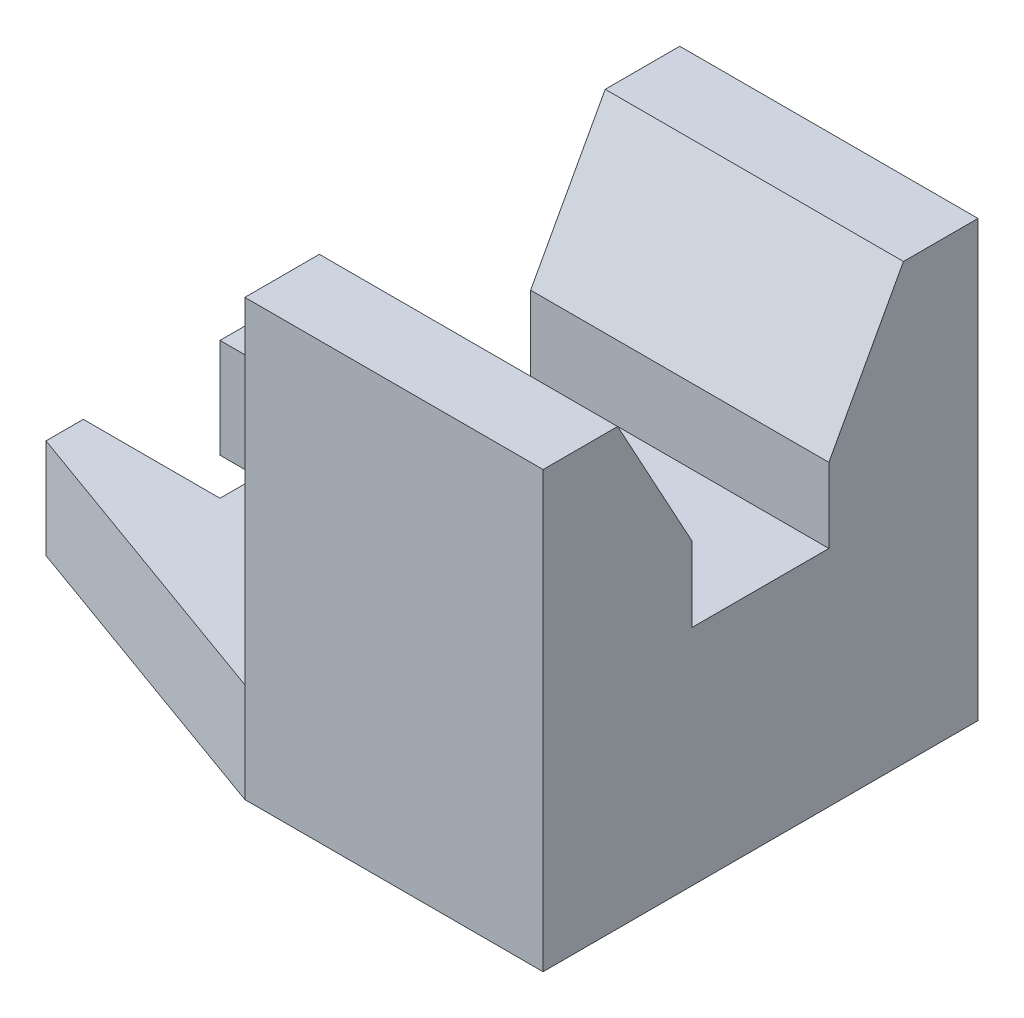
ISO-10303-21;
HEADER;
FILE_DESCRIPTION(('STEP AP214'),'2;1');
FILE_NAME('part.step','',(''),(''),'','','');
FILE_SCHEMA(('AUTOMOTIVE_DESIGN { 1 0 10303 214 1 1 1 1 }'));
ENDSEC;
DATA;
#1=APPLICATION_CONTEXT('core data for automotive mechanical design processes');
#2=APPLICATION_PROTOCOL_DEFINITION('international standard','automotive_design',2000,#1);
#3=PRODUCT_CONTEXT('',#1,'mechanical');
#4=PRODUCT('Part','Part','',(#3));
#5=PRODUCT_RELATED_PRODUCT_CATEGORY('part','',(#4));
#6=PRODUCT_DEFINITION_FORMATION('','',#4);
#7=PRODUCT_DEFINITION_CONTEXT('part definition',#1,'design');
#8=PRODUCT_DEFINITION('design','',#6,#7);
#9=PRODUCT_DEFINITION_SHAPE('','',#8);
#10=(LENGTH_UNIT() NAMED_UNIT(*) SI_UNIT(.MILLI.,.METRE.));
#11=(NAMED_UNIT(*) PLANE_ANGLE_UNIT() SI_UNIT($,.RADIAN.));
#12=(NAMED_UNIT(*) SI_UNIT($,.STERADIAN.) SOLID_ANGLE_UNIT());
#13=UNCERTAINTY_MEASURE_WITH_UNIT(LENGTH_MEASURE(1.E-05),#10,'distance_accuracy_value','');
#14=(GEOMETRIC_REPRESENTATION_CONTEXT(3) GLOBAL_UNCERTAINTY_ASSIGNED_CONTEXT((#13)) GLOBAL_UNIT_ASSIGNED_CONTEXT((#10,
#11,#12)) REPRESENTATION_CONTEXT('',''));
#15=CARTESIAN_POINT('',(0.,0.,0.));
#16=DIRECTION('',(0.,0.,1.));
#17=DIRECTION('',(1.,0.,0.));
#18=AXIS2_PLACEMENT_3D('',#15,#16,#17);
#19=CARTESIAN_POINT('',(0.,35.,0.));
#20=DIRECTION('',(0.,-1.,0.));
#21=DIRECTION('',(0.,0.,-1.));
#22=AXIS2_PLACEMENT_3D('',#19,#20,#21);
#23=PLANE('',#22);
#24=DIRECTION('',(0.,0.,-1.));
#25=VECTOR('',#24,1.);
#26=CARTESIAN_POINT('',(12.,35.,-17.5));
#27=LINE('',#26,#25);
#28=CARTESIAN_POINT('',(12.,35.,17.5));
#29=VERTEX_POINT('',#28);
#30=CARTESIAN_POINT('',(12.,35.,11.5));
#31=VERTEX_POINT('',#30);
#32=EDGE_CURVE('E247',#29,#31,#27,.T.);
#33=ORIENTED_EDGE('',*,*,#32,.T.);
#34=DIRECTION('',(-1.,0.,0.));
#35=VECTOR('',#34,1.);
#36=CARTESIAN_POINT('',(0.,35.,11.5));
#37=LINE('',#36,#35);
#38=CARTESIAN_POINT('',(-12.,35.,11.5));
#39=VERTEX_POINT('',#38);
#40=EDGE_CURVE('E11',#31,#39,#37,.T.);
#41=ORIENTED_EDGE('',*,*,#40,.T.);
#42=DIRECTION('',(0.,0.,1.));
#43=VECTOR('',#42,1.);
#44=CARTESIAN_POINT('',(-12.,35.,-17.5));
#45=LINE('',#44,#43);
#46=CARTESIAN_POINT('',(-12.,35.,17.5));
#47=VERTEX_POINT('',#46);
#48=EDGE_CURVE('E260',#39,#47,#45,.T.);
#49=ORIENTED_EDGE('',*,*,#48,.T.);
#50=DIRECTION('',(1.,0.,0.));
#51=VECTOR('',#50,1.);
#52=CARTESIAN_POINT('',(12.,35.,17.5));
#53=LINE('',#52,#51);
#54=EDGE_CURVE('E263',#47,#29,#53,.T.);
#55=ORIENTED_EDGE('',*,*,#54,.T.);
#56=EDGE_LOOP('',(#33,#41,#49,#55));
#57=FACE_BOUND('',#56,.T.);
#58=ADVANCED_FACE('F45',(#57),#23,.F.);
#59=CARTESIAN_POINT('',(0.,8.,0.));
#60=DIRECTION('',(0.,-1.,0.));
#61=DIRECTION('',(0.,0.,-1.));
#62=AXIS2_PLACEMENT_3D('',#59,#60,#61);
#63=PLANE('',#62);
#64=DIRECTION('',(0.,0.,1.));
#65=VECTOR('',#64,1.);
#66=CARTESIAN_POINT('',(-12.,8.,-17.5));
#67=LINE('',#66,#65);
#68=CARTESIAN_POINT('',(-12.,8.,-17.5));
#69=VERTEX_POINT('',#68);
#70=CARTESIAN_POINT('',(-12.,8.,17.5));
#71=VERTEX_POINT('',#70);
#72=EDGE_CURVE('E117',#69,#71,#67,.T.);
#73=ORIENTED_EDGE('',*,*,#72,.F.);
#74=DIRECTION('',(-0.940887411868726,0.,0.338719468272743));
#75=VECTOR('',#74,1.);
#76=CARTESIAN_POINT('',(-12.,8.,-17.5));
#77=LINE('',#76,#75);
#78=CARTESIAN_POINT('',(-36.9999999999999,8.,-8.5));
#79=VERTEX_POINT('',#78);
#80=EDGE_CURVE('E197',#69,#79,#77,.T.);
#81=ORIENTED_EDGE('',*,*,#80,.T.);
#82=DIRECTION('',(0.,0.,1.));
#83=VECTOR('',#82,1.);
#84=CARTESIAN_POINT('',(-36.9999999999999,8.,-8.5));
#85=LINE('',#84,#83);
#86=CARTESIAN_POINT('',(-37.,8.,-5.5));
#87=VERTEX_POINT('',#86);
#88=EDGE_CURVE('E276',#79,#87,#85,.T.);
#89=ORIENTED_EDGE('',*,*,#88,.T.);
#90=DIRECTION('',(1.,0.,0.));
#91=VECTOR('',#90,1.);
#92=CARTESIAN_POINT('',(-37.,8.,-5.5));
#93=LINE('',#92,#91);
#94=CARTESIAN_POINT('',(-26.,8.,-5.5));
#95=VERTEX_POINT('',#94);
#96=EDGE_CURVE('E138',#87,#95,#93,.T.);
#97=ORIENTED_EDGE('',*,*,#96,.T.);
#98=DIRECTION('',(0.,0.,1.));
#99=VECTOR('',#98,1.);
#100=CARTESIAN_POINT('',(-26.,8.,-5.5));
#101=LINE('',#100,#99);
#102=CARTESIAN_POINT('',(-26.,8.,5.5));
#103=VERTEX_POINT('',#102);
#104=EDGE_CURVE('E131',#95,#103,#101,.T.);
#105=ORIENTED_EDGE('',*,*,#104,.T.);
#106=DIRECTION('',(-1.,0.,0.));
#107=VECTOR('',#106,1.);
#108=CARTESIAN_POINT('',(-37.,8.,5.5));
#109=LINE('',#108,#107);
#110=CARTESIAN_POINT('',(-37.,8.,5.5));
#111=VERTEX_POINT('',#110);
#112=EDGE_CURVE('E135',#103,#111,#109,.T.);
#113=ORIENTED_EDGE('',*,*,#112,.T.);
#114=DIRECTION('',(0.,0.,1.));
#115=VECTOR('',#114,1.);
#116=CARTESIAN_POINT('',(-36.9999999999999,8.,8.5));
#117=LINE('',#116,#115);
#118=CARTESIAN_POINT('',(-36.9999999999999,8.,8.5));
#119=VERTEX_POINT('',#118);
#120=EDGE_CURVE('E70',#111,#119,#117,.T.);
#121=ORIENTED_EDGE('',*,*,#120,.T.);
#122=DIRECTION('',(0.940887411868726,0.,0.338719468272743));
#123=VECTOR('',#122,1.);
#124=CARTESIAN_POINT('',(-12.,8.,17.5));
#125=LINE('',#124,#123);
#126=EDGE_CURVE('E160',#119,#71,#125,.T.);
#127=ORIENTED_EDGE('',*,*,#126,.T.);
#128=EDGE_LOOP('',(#73,#81,#89,#97,#105,#113,#121,#127));
#129=FACE_BOUND('',#128,.T.);
#130=ADVANCED_FACE('F133',(#129),#63,.F.);
#131=CARTESIAN_POINT('',(12.,8.,17.5));
#132=DIRECTION('',(-1.,0.,0.));
#133=DIRECTION('',(0.,0.,1.));
#134=AXIS2_PLACEMENT_3D('',#131,#132,#133);
#135=PLANE('',#134);
#136=DIRECTION('',(0.,1.,0.));
#137=VECTOR('',#136,1.);
#138=CARTESIAN_POINT('',(12.,8.,5.5));
#139=LINE('',#138,#137);
#140=CARTESIAN_POINT('',(12.,18.,5.5));
#141=VERTEX_POINT('',#140);
#142=CARTESIAN_POINT('',(12.,24.,5.5));
#143=VERTEX_POINT('',#142);
#144=EDGE_CURVE('E253',#141,#143,#139,.T.);
#145=ORIENTED_EDGE('',*,*,#144,.T.);
#146=DIRECTION('',(0.,0.877895572914385,0.478852130680572));
#147=VECTOR('',#146,1.);
#148=CARTESIAN_POINT('',(12.,16.7133757961783,1.52547770700637));
#149=LINE('',#148,#147);
#150=EDGE_CURVE('E376',#143,#31,#149,.T.);
#151=ORIENTED_EDGE('',*,*,#150,.T.);
#152=ORIENTED_EDGE('',*,*,#32,.F.);
#153=DIRECTION('',(0.,-1.,0.));
#154=VECTOR('',#153,1.);
#155=CARTESIAN_POINT('',(12.,8.,17.5));
#156=LINE('',#155,#154);
#157=CARTESIAN_POINT('',(12.,0.,17.5));
#158=VERTEX_POINT('',#157);
#159=EDGE_CURVE('E166',#29,#158,#156,.T.);
#160=ORIENTED_EDGE('',*,*,#159,.T.);
#161=DIRECTION('',(0.,0.,-1.));
#162=VECTOR('',#161,1.);
#163=CARTESIAN_POINT('',(12.,0.,17.5));
#164=LINE('',#163,#162);
#165=CARTESIAN_POINT('',(12.,0.,-17.5));
#166=VERTEX_POINT('',#165);
#167=EDGE_CURVE('E167',#158,#166,#164,.T.);
#168=ORIENTED_EDGE('',*,*,#167,.T.);
#169=DIRECTION('',(0.,-1.,0.));
#170=VECTOR('',#169,1.);
#171=CARTESIAN_POINT('',(12.,8.,-17.5));
#172=LINE('',#171,#170);
#173=CARTESIAN_POINT('',(12.,35.,-17.5));
#174=VERTEX_POINT('',#173);
#175=EDGE_CURVE('E223',#174,#166,#172,.T.);
#176=ORIENTED_EDGE('',*,*,#175,.F.);
#177=CARTESIAN_POINT('',(12.,35.,-11.5));
#178=VERTEX_POINT('',#177);
#179=EDGE_CURVE('E234',#178,#174,#27,.T.);
#180=ORIENTED_EDGE('',*,*,#179,.F.);
#181=DIRECTION('',(0.,-0.877895572914385,0.478852130680572));
#182=VECTOR('',#181,1.);
#183=CARTESIAN_POINT('',(12.,2.,6.49999999999997));
#184=LINE('',#183,#182);
#185=CARTESIAN_POINT('',(12.,24.,-5.5));
#186=VERTEX_POINT('',#185);
#187=EDGE_CURVE('E61',#178,#186,#184,.T.);
#188=ORIENTED_EDGE('',*,*,#187,.T.);
#189=DIRECTION('',(0.,-1.,0.));
#190=VECTOR('',#189,1.);
#191=CARTESIAN_POINT('',(12.,7.99999999999999,-5.5));
#192=LINE('',#191,#190);
#193=CARTESIAN_POINT('',(12.,18.,-5.5));
#194=VERTEX_POINT('',#193);
#195=EDGE_CURVE('E343',#186,#194,#192,.T.);
#196=ORIENTED_EDGE('',*,*,#195,.T.);
#197=DIRECTION('',(0.,0.,1.));
#198=VECTOR('',#197,1.);
#199=CARTESIAN_POINT('',(12.,18.,17.5));
#200=LINE('',#199,#198);
#201=EDGE_CURVE('E380',#194,#141,#200,.T.);
#202=ORIENTED_EDGE('',*,*,#201,.T.);
#203=EDGE_LOOP('',(#145,#151,#152,#160,#168,#176,#180,#188,#196,#202));
#204=FACE_BOUND('',#203,.T.);
#205=ADVANCED_FACE('F47',(#204),#135,.F.);
#206=CARTESIAN_POINT('',(-12.,8.,-17.5));
#207=DIRECTION('',(0.,0.,1.));
#208=DIRECTION('',(1.,0.,0.));
#209=AXIS2_PLACEMENT_3D('',#206,#207,#208);
#210=PLANE('',#209);
#211=DIRECTION('',(-1.,0.,0.));
#212=VECTOR('',#211,1.);
#213=CARTESIAN_POINT('',(-12.,0.,-17.5));
#214=LINE('',#213,#212);
#215=CARTESIAN_POINT('',(-12.,0.,-17.5));
#216=VERTEX_POINT('',#215);
#217=EDGE_CURVE('E171',#166,#216,#214,.T.);
#218=ORIENTED_EDGE('',*,*,#217,.T.);
#219=DIRECTION('',(0.,-1.,0.));
#220=VECTOR('',#219,1.);
#221=CARTESIAN_POINT('',(-12.,8.,-17.5));
#222=LINE('',#221,#220);
#223=EDGE_CURVE('E219',#69,#216,#222,.T.);
#224=ORIENTED_EDGE('',*,*,#223,.F.);
#225=DIRECTION('',(0.,-1.,0.));
#226=VECTOR('',#225,1.);
#227=CARTESIAN_POINT('',(-12.,35.,-17.5));
#228=LINE('',#227,#226);
#229=CARTESIAN_POINT('',(-12.,35.,-17.5));
#230=VERTEX_POINT('',#229);
#231=EDGE_CURVE('E172',#230,#69,#228,.T.);
#232=ORIENTED_EDGE('',*,*,#231,.F.);
#233=DIRECTION('',(-1.,0.,0.));
#234=VECTOR('',#233,1.);
#235=CARTESIAN_POINT('',(12.,35.,-17.5));
#236=LINE('',#235,#234);
#237=EDGE_CURVE('E252',#174,#230,#236,.T.);
#238=ORIENTED_EDGE('',*,*,#237,.F.);
#239=ORIENTED_EDGE('',*,*,#175,.T.);
#240=EDGE_LOOP('',(#218,#224,#232,#238,#239));
#241=FACE_BOUND('',#240,.T.);
#242=ADVANCED_FACE('F303',(#241),#210,.F.);
#243=CARTESIAN_POINT('',(-12.,8.,-17.5));
#244=DIRECTION('',(0.338719468272743,0.,0.940887411868726));
#245=DIRECTION('',(0.940887411868727,0.,-0.338719468272743));
#246=AXIS2_PLACEMENT_3D('',#243,#244,#245);
#247=PLANE('',#246);
#248=DIRECTION('',(-0.940887411868726,0.,0.338719468272743));
#249=VECTOR('',#248,1.);
#250=CARTESIAN_POINT('',(-12.,0.,-17.5));
#251=LINE('',#250,#249);
#252=CARTESIAN_POINT('',(-36.9999999999999,0.,-8.5));
#253=VERTEX_POINT('',#252);
#254=EDGE_CURVE('E175',#216,#253,#251,.T.);
#255=ORIENTED_EDGE('',*,*,#254,.T.);
#256=DIRECTION('',(0.,-1.,0.));
#257=VECTOR('',#256,1.);
#258=CARTESIAN_POINT('',(-36.9999999999999,8.,-8.5));
#259=LINE('',#258,#257);
#260=EDGE_CURVE('E215',#79,#253,#259,.T.);
#261=ORIENTED_EDGE('',*,*,#260,.F.);
#262=ORIENTED_EDGE('',*,*,#80,.F.);
#263=ORIENTED_EDGE('',*,*,#223,.T.);
#264=EDGE_LOOP('',(#255,#261,#262,#263));
#265=FACE_BOUND('',#264,.T.);
#266=ADVANCED_FACE('F440',(#265),#247,.F.);
#267=CARTESIAN_POINT('',(-36.9999999999999,8.,-8.5));
#268=DIRECTION('',(1.,0.,0.));
#269=DIRECTION('',(0.,0.,-1.));
#270=AXIS2_PLACEMENT_3D('',#267,#268,#269);
#271=PLANE('',#270);
#272=DIRECTION('',(0.,0.,1.));
#273=VECTOR('',#272,1.);
#274=CARTESIAN_POINT('',(-36.9999999999999,0.,-8.5));
#275=LINE('',#274,#273);
#276=CARTESIAN_POINT('',(-37.,0.,-5.5));
#277=VERTEX_POINT('',#276);
#278=EDGE_CURVE('E178',#253,#277,#275,.T.);
#279=ORIENTED_EDGE('',*,*,#278,.T.);
#280=DIRECTION('',(0.,-1.,0.));
#281=VECTOR('',#280,1.);
#282=CARTESIAN_POINT('',(-37.,8.,-5.5));
#283=LINE('',#282,#281);
#284=EDGE_CURVE('E211',#87,#277,#283,.T.);
#285=ORIENTED_EDGE('',*,*,#284,.F.);
#286=ORIENTED_EDGE('',*,*,#88,.F.);
#287=ORIENTED_EDGE('',*,*,#260,.T.);
#288=EDGE_LOOP('',(#279,#285,#286,#287));
#289=FACE_BOUND('',#288,.T.);
#290=ADVANCED_FACE('F436',(#289),#271,.F.);
#291=CARTESIAN_POINT('',(-37.,8.,-5.5));
#292=DIRECTION('',(0.,0.,-1.));
#293=DIRECTION('',(-1.,0.,0.));
#294=AXIS2_PLACEMENT_3D('',#291,#292,#293);
#295=PLANE('',#294);
#296=DIRECTION('',(1.,0.,0.));
#297=VECTOR('',#296,1.);
#298=CARTESIAN_POINT('',(-37.,0.,-5.5));
#299=LINE('',#298,#297);
#300=CARTESIAN_POINT('',(-26.,0.,-5.5));
#301=VERTEX_POINT('',#300);
#302=EDGE_CURVE('E181',#277,#301,#299,.T.);
#303=ORIENTED_EDGE('',*,*,#302,.T.);
#304=DIRECTION('',(0.,-1.,0.));
#305=VECTOR('',#304,1.);
#306=CARTESIAN_POINT('',(-26.,8.,-5.5));
#307=LINE('',#306,#305);
#308=EDGE_CURVE('E152',#95,#301,#307,.T.);
#309=ORIENTED_EDGE('',*,*,#308,.F.);
#310=ORIENTED_EDGE('',*,*,#96,.F.);
#311=ORIENTED_EDGE('',*,*,#284,.T.);
#312=EDGE_LOOP('',(#303,#309,#310,#311));
#313=FACE_BOUND('',#312,.T.);
#314=ADVANCED_FACE('F433',(#313),#295,.F.);
#315=CARTESIAN_POINT('',(-26.,8.,-5.5));
#316=DIRECTION('',(1.,0.,0.));
#317=DIRECTION('',(0.,0.,-1.));
#318=AXIS2_PLACEMENT_3D('',#315,#316,#317);
#319=PLANE('',#318);
#320=DIRECTION('',(0.,0.,1.));
#321=VECTOR('',#320,1.);
#322=CARTESIAN_POINT('',(-26.,0.,-5.5));
#323=LINE('',#322,#321);
#324=CARTESIAN_POINT('',(-26.,0.,5.5));
#325=VERTEX_POINT('',#324);
#326=EDGE_CURVE('E148',#301,#325,#323,.T.);
#327=ORIENTED_EDGE('',*,*,#326,.T.);
#328=DIRECTION('',(0.,-1.,0.));
#329=VECTOR('',#328,1.);
#330=CARTESIAN_POINT('',(-26.,8.,5.5));
#331=LINE('',#330,#329);
#332=EDGE_CURVE('E145',#103,#325,#331,.T.);
#333=ORIENTED_EDGE('',*,*,#332,.F.);
#334=ORIENTED_EDGE('',*,*,#104,.F.);
#335=ORIENTED_EDGE('',*,*,#308,.T.);
#336=EDGE_LOOP('',(#327,#333,#334,#335));
#337=FACE_BOUND('',#336,.T.);
#338=ADVANCED_FACE('F146',(#337),#319,.F.);
#339=CARTESIAN_POINT('',(-37.,8.,5.5));
#340=DIRECTION('',(0.,0.,1.));
#341=DIRECTION('',(1.,0.,0.));
#342=AXIS2_PLACEMENT_3D('',#339,#340,#341);
#343=PLANE('',#342);
#344=DIRECTION('',(-1.,0.,0.));
#345=VECTOR('',#344,1.);
#346=CARTESIAN_POINT('',(-37.,0.,5.5));
#347=LINE('',#346,#345);
#348=CARTESIAN_POINT('',(-37.,0.,5.5));
#349=VERTEX_POINT('',#348);
#350=EDGE_CURVE('E186',#325,#349,#347,.T.);
#351=ORIENTED_EDGE('',*,*,#350,.T.);
#352=DIRECTION('',(0.,-1.,0.));
#353=VECTOR('',#352,1.);
#354=CARTESIAN_POINT('',(-37.,8.,5.5));
#355=LINE('',#354,#353);
#356=EDGE_CURVE('E153',#111,#349,#355,.T.);
#357=ORIENTED_EDGE('',*,*,#356,.F.);
#358=ORIENTED_EDGE('',*,*,#112,.F.);
#359=ORIENTED_EDGE('',*,*,#332,.T.);
#360=EDGE_LOOP('',(#351,#357,#358,#359));
#361=FACE_BOUND('',#360,.T.);
#362=ADVANCED_FACE('F155',(#361),#343,.F.);
#363=CARTESIAN_POINT('',(-36.9999999999999,8.,8.5));
#364=DIRECTION('',(1.,0.,0.));
#365=DIRECTION('',(0.,0.,-1.));
#366=AXIS2_PLACEMENT_3D('',#363,#364,#365);
#367=PLANE('',#366);
#368=DIRECTION('',(0.,0.,1.));
#369=VECTOR('',#368,1.);
#370=CARTESIAN_POINT('',(-36.9999999999999,0.,8.5));
#371=LINE('',#370,#369);
#372=CARTESIAN_POINT('',(-36.9999999999999,0.,8.5));
#373=VERTEX_POINT('',#372);
#374=EDGE_CURVE('E189',#349,#373,#371,.T.);
#375=ORIENTED_EDGE('',*,*,#374,.T.);
#376=DIRECTION('',(0.,-1.,0.));
#377=VECTOR('',#376,1.);
#378=CARTESIAN_POINT('',(-36.9999999999999,8.,8.5));
#379=LINE('',#378,#377);
#380=EDGE_CURVE('E203',#119,#373,#379,.T.);
#381=ORIENTED_EDGE('',*,*,#380,.F.);
#382=ORIENTED_EDGE('',*,*,#120,.F.);
#383=ORIENTED_EDGE('',*,*,#356,.T.);
#384=EDGE_LOOP('',(#375,#381,#382,#383));
#385=FACE_BOUND('',#384,.T.);
#386=ADVANCED_FACE('F424',(#385),#367,.F.);
#387=CARTESIAN_POINT('',(-12.,8.,17.5));
#388=DIRECTION('',(0.338719468272743,0.,-0.940887411868726));
#389=DIRECTION('',(-0.940887411868727,0.,-0.338719468272743));
#390=AXIS2_PLACEMENT_3D('',#387,#388,#389);
#391=PLANE('',#390);
#392=DIRECTION('',(0.940887411868726,0.,0.338719468272743));
#393=VECTOR('',#392,1.);
#394=CARTESIAN_POINT('',(-12.,0.,17.5));
#395=LINE('',#394,#393);
#396=CARTESIAN_POINT('',(-12.,0.,17.5));
#397=VERTEX_POINT('',#396);
#398=EDGE_CURVE('E192',#373,#397,#395,.T.);
#399=ORIENTED_EDGE('',*,*,#398,.T.);
#400=DIRECTION('',(0.,-1.,0.));
#401=VECTOR('',#400,1.);
#402=CARTESIAN_POINT('',(-12.,8.,17.5));
#403=LINE('',#402,#401);
#404=EDGE_CURVE('E200',#71,#397,#403,.T.);
#405=ORIENTED_EDGE('',*,*,#404,.F.);
#406=ORIENTED_EDGE('',*,*,#126,.F.);
#407=ORIENTED_EDGE('',*,*,#380,.T.);
#408=EDGE_LOOP('',(#399,#405,#406,#407));
#409=FACE_BOUND('',#408,.T.);
#410=ADVANCED_FACE('F421',(#409),#391,.F.);
#411=CARTESIAN_POINT('',(-12.,8.,17.5));
#412=DIRECTION('',(0.,0.,-1.));
#413=DIRECTION('',(-1.,0.,0.));
#414=AXIS2_PLACEMENT_3D('',#411,#412,#413);
#415=PLANE('',#414);
#416=DIRECTION('',(1.,0.,0.));
#417=VECTOR('',#416,1.);
#418=CARTESIAN_POINT('',(-12.,0.,17.5));
#419=LINE('',#418,#417);
#420=EDGE_CURVE('E110',#397,#158,#419,.T.);
#421=ORIENTED_EDGE('',*,*,#420,.T.);
#422=ORIENTED_EDGE('',*,*,#159,.F.);
#423=ORIENTED_EDGE('',*,*,#54,.F.);
#424=DIRECTION('',(0.,-1.,0.));
#425=VECTOR('',#424,1.);
#426=CARTESIAN_POINT('',(-12.,35.,17.5));
#427=LINE('',#426,#425);
#428=EDGE_CURVE('E266',#47,#71,#427,.T.);
#429=ORIENTED_EDGE('',*,*,#428,.T.);
#430=ORIENTED_EDGE('',*,*,#404,.T.);
#431=EDGE_LOOP('',(#421,#422,#423,#429,#430));
#432=FACE_BOUND('',#431,.T.);
#433=ADVANCED_FACE('F294',(#432),#415,.F.);
#434=CARTESIAN_POINT('',(0.,0.,0.));
#435=DIRECTION('',(0.,-1.,0.));
#436=DIRECTION('',(0.,0.,-1.));
#437=AXIS2_PLACEMENT_3D('',#434,#435,#436);
#438=PLANE('',#437);
#439=ORIENTED_EDGE('',*,*,#167,.F.);
#440=ORIENTED_EDGE('',*,*,#420,.F.);
#441=ORIENTED_EDGE('',*,*,#398,.F.);
#442=ORIENTED_EDGE('',*,*,#374,.F.);
#443=ORIENTED_EDGE('',*,*,#350,.F.);
#444=ORIENTED_EDGE('',*,*,#326,.F.);
#445=ORIENTED_EDGE('',*,*,#302,.F.);
#446=ORIENTED_EDGE('',*,*,#278,.F.);
#447=ORIENTED_EDGE('',*,*,#254,.F.);
#448=ORIENTED_EDGE('',*,*,#217,.F.);
#449=EDGE_LOOP('',(#439,#440,#441,#442,#443,#444,#445,#446,#447,#448));
#450=FACE_BOUND('',#449,.T.);
#451=ADVANCED_FACE('F298',(#450),#438,.T.);
#452=CARTESIAN_POINT('',(-12.,35.,-17.5));
#453=DIRECTION('',(1.,0.,0.));
#454=DIRECTION('',(0.,0.,-1.));
#455=AXIS2_PLACEMENT_3D('',#452,#453,#454);
#456=PLANE('',#455);
#457=ORIENTED_EDGE('',*,*,#48,.F.);
#458=DIRECTION('',(0.,0.877895572914385,0.478852130680572));
#459=VECTOR('',#458,1.);
#460=CARTESIAN_POINT('',(-12.,35.,11.5));
#461=LINE('',#460,#459);
#462=CARTESIAN_POINT('',(-12.,24.,5.5));
#463=VERTEX_POINT('',#462);
#464=EDGE_CURVE('E346',#463,#39,#461,.T.);
#465=ORIENTED_EDGE('',*,*,#464,.F.);
#466=DIRECTION('',(0.,1.,0.));
#467=VECTOR('',#466,1.);
#468=CARTESIAN_POINT('',(-12.,24.,5.5));
#469=LINE('',#468,#467);
#470=CARTESIAN_POINT('',(-12.,18.,5.5));
#471=VERTEX_POINT('',#470);
#472=EDGE_CURVE('E358',#471,#463,#469,.T.);
#473=ORIENTED_EDGE('',*,*,#472,.F.);
#474=DIRECTION('',(0.,0.,1.));
#475=VECTOR('',#474,1.);
#476=CARTESIAN_POINT('',(-12.,18.,-5.5));
#477=LINE('',#476,#475);
#478=CARTESIAN_POINT('',(-12.,18.,-5.5));
#479=VERTEX_POINT('',#478);
#480=EDGE_CURVE('E354',#479,#471,#477,.T.);
#481=ORIENTED_EDGE('',*,*,#480,.F.);
#482=DIRECTION('',(0.,-1.,0.));
#483=VECTOR('',#482,1.);
#484=CARTESIAN_POINT('',(-12.,24.,-5.5));
#485=LINE('',#484,#483);
#486=CARTESIAN_POINT('',(-12.,24.,-5.5));
#487=VERTEX_POINT('',#486);
#488=EDGE_CURVE('E341',#487,#479,#485,.T.);
#489=ORIENTED_EDGE('',*,*,#488,.F.);
#490=DIRECTION('',(0.,-0.877895572914385,0.478852130680572));
#491=VECTOR('',#490,1.);
#492=CARTESIAN_POINT('',(-12.,35.,-11.5));
#493=LINE('',#492,#491);
#494=CARTESIAN_POINT('',(-12.,35.,-11.5));
#495=VERTEX_POINT('',#494);
#496=EDGE_CURVE('E348',#495,#487,#493,.T.);
#497=ORIENTED_EDGE('',*,*,#496,.F.);
#498=EDGE_CURVE('E238',#230,#495,#45,.T.);
#499=ORIENTED_EDGE('',*,*,#498,.F.);
#500=ORIENTED_EDGE('',*,*,#231,.T.);
#501=ORIENTED_EDGE('',*,*,#72,.T.);
#502=ORIENTED_EDGE('',*,*,#428,.F.);
#503=EDGE_LOOP('',(#457,#465,#473,#481,#489,#497,#499,#500,#501,#502));
#504=FACE_BOUND('',#503,.T.);
#505=ADVANCED_FACE('F293',(#504),#456,.F.);
#506=ORIENTED_EDGE('',*,*,#498,.T.);
#507=DIRECTION('',(1.,0.,0.));
#508=VECTOR('',#507,1.);
#509=CARTESIAN_POINT('',(0.,35.,-11.5));
#510=LINE('',#509,#508);
#511=EDGE_CURVE('E54',#495,#178,#510,.T.);
#512=ORIENTED_EDGE('',*,*,#511,.T.);
#513=ORIENTED_EDGE('',*,*,#179,.T.);
#514=ORIENTED_EDGE('',*,*,#237,.T.);
#515=EDGE_LOOP('',(#506,#512,#513,#514));
#516=FACE_BOUND('',#515,.T.);
#517=ADVANCED_FACE('F231',(#516),#23,.F.);
#518=CARTESIAN_POINT('',(15.,24.,5.5));
#519=DIRECTION('',(0.,0.,1.));
#520=DIRECTION('',(0.,-1.,0.));
#521=AXIS2_PLACEMENT_3D('',#518,#519,#520);
#522=PLANE('',#521);
#523=DIRECTION('',(-1.,0.,0.));
#524=VECTOR('',#523,1.);
#525=CARTESIAN_POINT('',(15.,18.,5.5));
#526=LINE('',#525,#524);
#527=EDGE_CURVE('E369',#141,#471,#526,.T.);
#528=ORIENTED_EDGE('',*,*,#527,.T.);
#529=ORIENTED_EDGE('',*,*,#472,.T.);
#530=DIRECTION('',(-1.,0.,0.));
#531=VECTOR('',#530,1.);
#532=CARTESIAN_POINT('',(15.,24.,5.5));
#533=LINE('',#532,#531);
#534=EDGE_CURVE('E366',#143,#463,#533,.T.);
#535=ORIENTED_EDGE('',*,*,#534,.F.);
#536=ORIENTED_EDGE('',*,*,#144,.F.);
#537=EDGE_LOOP('',(#528,#529,#535,#536));
#538=FACE_BOUND('',#537,.T.);
#539=ADVANCED_FACE('F387',(#538),#522,.F.);
#540=CARTESIAN_POINT('',(15.,18.,-5.5));
#541=DIRECTION('',(0.,-1.,0.));
#542=DIRECTION('',(0.,0.,-1.));
#543=AXIS2_PLACEMENT_3D('',#540,#541,#542);
#544=PLANE('',#543);
#545=DIRECTION('',(-1.,0.,0.));
#546=VECTOR('',#545,1.);
#547=CARTESIAN_POINT('',(15.,18.,-5.5));
#548=LINE('',#547,#546);
#549=EDGE_CURVE('E345',#194,#479,#548,.T.);
#550=ORIENTED_EDGE('',*,*,#549,.T.);
#551=ORIENTED_EDGE('',*,*,#480,.T.);
#552=ORIENTED_EDGE('',*,*,#527,.F.);
#553=ORIENTED_EDGE('',*,*,#201,.F.);
#554=EDGE_LOOP('',(#550,#551,#552,#553));
#555=FACE_BOUND('',#554,.T.);
#556=ADVANCED_FACE('F389',(#555),#544,.F.);
#557=CARTESIAN_POINT('',(15.,24.,-5.5));
#558=DIRECTION('',(0.,0.,-1.));
#559=DIRECTION('',(0.,1.,0.));
#560=AXIS2_PLACEMENT_3D('',#557,#558,#559);
#561=PLANE('',#560);
#562=DIRECTION('',(-1.,0.,0.));
#563=VECTOR('',#562,1.);
#564=CARTESIAN_POINT('',(15.,24.,-5.5));
#565=LINE('',#564,#563);
#566=EDGE_CURVE('E337',#186,#487,#565,.T.);
#567=ORIENTED_EDGE('',*,*,#566,.T.);
#568=ORIENTED_EDGE('',*,*,#488,.T.);
#569=ORIENTED_EDGE('',*,*,#549,.F.);
#570=ORIENTED_EDGE('',*,*,#195,.F.);
#571=EDGE_LOOP('',(#567,#568,#569,#570));
#572=FACE_BOUND('',#571,.T.);
#573=ADVANCED_FACE('F338',(#572),#561,.F.);
#574=CARTESIAN_POINT('',(15.,35.,11.5));
#575=DIRECTION('',(0.,-0.478852130680572,0.877895572914385));
#576=DIRECTION('',(0.,-0.877895572914385,-0.478852130680572));
#577=AXIS2_PLACEMENT_3D('',#574,#575,#576);
#578=PLANE('',#577);
#579=ORIENTED_EDGE('',*,*,#534,.T.);
#580=ORIENTED_EDGE('',*,*,#464,.T.);
#581=ORIENTED_EDGE('',*,*,#40,.F.);
#582=ORIENTED_EDGE('',*,*,#150,.F.);
#583=EDGE_LOOP('',(#579,#580,#581,#582));
#584=FACE_BOUND('',#583,.T.);
#585=ADVANCED_FACE('F391',(#584),#578,.F.);
#586=CARTESIAN_POINT('',(15.,35.,-11.5));
#587=DIRECTION('',(0.,-0.478852130680572,-0.877895572914385));
#588=DIRECTION('',(0.,0.877895572914385,-0.478852130680572));
#589=AXIS2_PLACEMENT_3D('',#586,#587,#588);
#590=PLANE('',#589);
#591=ORIENTED_EDGE('',*,*,#511,.F.);
#592=ORIENTED_EDGE('',*,*,#496,.T.);
#593=ORIENTED_EDGE('',*,*,#566,.F.);
#594=ORIENTED_EDGE('',*,*,#187,.F.);
#595=EDGE_LOOP('',(#591,#592,#593,#594));
#596=FACE_BOUND('',#595,.T.);
#597=ADVANCED_FACE('F349',(#596),#590,.F.);
#598=CLOSED_SHELL('',(#58,#130,#205,#242,#266,#290,#314,#338,#362,#386,#410,#433,#451,#505,#517,
#539,#556,#573,#585,#597));
#599=MANIFOLD_SOLID_BREP('B2',#598);
#600=ADVANCED_BREP_SHAPE_REPRESENTATION('',(#18,#599),#14);
#601=SHAPE_DEFINITION_REPRESENTATION(#9,#600);
ENDSEC;
END-ISO-10303-21;
